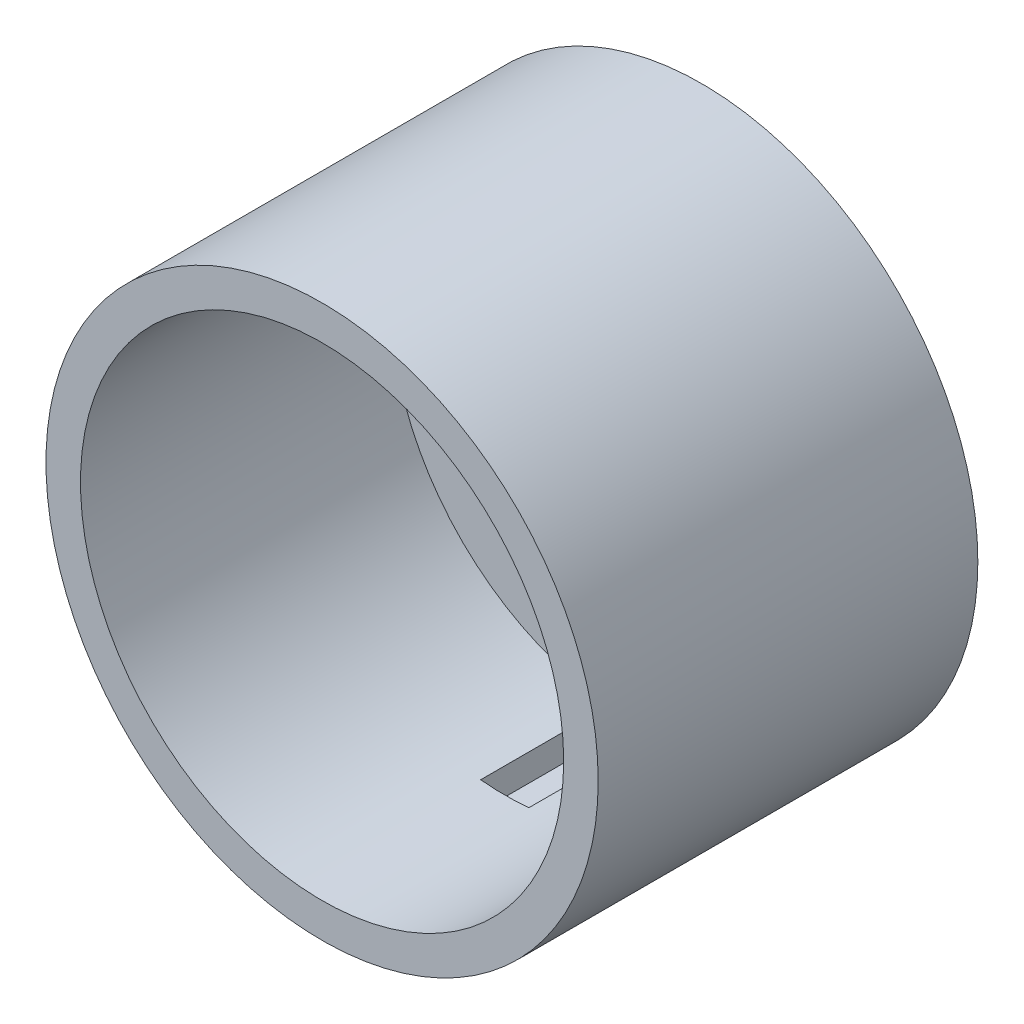
ISO-10303-21;
HEADER;
FILE_DESCRIPTION(('STEP AP214'),'2;1');
FILE_NAME('part.step','',(''),(''),'','','');
FILE_SCHEMA(('AUTOMOTIVE_DESIGN { 1 0 10303 214 1 1 1 1 }'));
ENDSEC;
DATA;
#1=APPLICATION_CONTEXT('core data for automotive mechanical design processes');
#2=APPLICATION_PROTOCOL_DEFINITION('international standard','automotive_design',2000,#1);
#3=PRODUCT_CONTEXT('',#1,'mechanical');
#4=PRODUCT('Part','Part','',(#3));
#5=PRODUCT_RELATED_PRODUCT_CATEGORY('part','',(#4));
#6=PRODUCT_DEFINITION_FORMATION('','',#4);
#7=PRODUCT_DEFINITION_CONTEXT('part definition',#1,'design');
#8=PRODUCT_DEFINITION('design','',#6,#7);
#9=PRODUCT_DEFINITION_SHAPE('','',#8);
#10=(LENGTH_UNIT() NAMED_UNIT(*) SI_UNIT(.MILLI.,.METRE.));
#11=(NAMED_UNIT(*) PLANE_ANGLE_UNIT() SI_UNIT($,.RADIAN.));
#12=(NAMED_UNIT(*) SI_UNIT($,.STERADIAN.) SOLID_ANGLE_UNIT());
#13=UNCERTAINTY_MEASURE_WITH_UNIT(LENGTH_MEASURE(1.E-05),#10,'distance_accuracy_value','');
#14=(GEOMETRIC_REPRESENTATION_CONTEXT(3) GLOBAL_UNCERTAINTY_ASSIGNED_CONTEXT((#13)) GLOBAL_UNIT_ASSIGNED_CONTEXT((#10,
#11,#12)) REPRESENTATION_CONTEXT('',''));
#15=CARTESIAN_POINT('',(0.,0.,0.));
#16=DIRECTION('',(0.,0.,1.));
#17=DIRECTION('',(1.,0.,0.));
#18=AXIS2_PLACEMENT_3D('',#15,#16,#17);
#19=CARTESIAN_POINT('',(-1.4,15.5,11.41));
#20=DIRECTION('',(1.,0.,0.));
#21=DIRECTION('',(0.,1.,0.));
#22=AXIS2_PLACEMENT_3D('',#19,#20,#21);
#23=PLANE('',#22);
#24=DIRECTION('',(0.,0.,-1.));
#25=VECTOR('',#24,1.);
#26=CARTESIAN_POINT('',(-1.4,3.,5.));
#27=LINE('',#26,#25);
#28=CARTESIAN_POINT('',(-1.4,3.,4.));
#29=VERTEX_POINT('',#28);
#30=CARTESIAN_POINT('',(-1.4,3.,0.));
#31=VERTEX_POINT('',#30);
#32=EDGE_CURVE('E202',#29,#31,#27,.T.);
#33=ORIENTED_EDGE('',*,*,#32,.F.);
#34=DIRECTION('',(0.,-1.,0.));
#35=VECTOR('',#34,1.);
#36=CARTESIAN_POINT('',(-1.4,15.5,4.));
#37=LINE('',#36,#35);
#38=CARTESIAN_POINT('',(-1.4,-5.3,4.));
#39=VERTEX_POINT('',#38);
#40=EDGE_CURVE('E175',#29,#39,#37,.T.);
#41=ORIENTED_EDGE('',*,*,#40,.T.);
#42=DIRECTION('',(0.,0.,-1.));
#43=VECTOR('',#42,1.);
#44=CARTESIAN_POINT('',(-1.4,-5.3,5.));
#45=LINE('',#44,#43);
#46=CARTESIAN_POINT('',(-1.4,-5.3,0.));
#47=VERTEX_POINT('',#46);
#48=EDGE_CURVE('E214',#39,#47,#45,.T.);
#49=ORIENTED_EDGE('',*,*,#48,.T.);
#50=DIRECTION('',(0.,-1.,0.));
#51=VECTOR('',#50,1.);
#52=CARTESIAN_POINT('',(-1.4,15.5,0.));
#53=LINE('',#52,#51);
#54=EDGE_CURVE('E236',#31,#47,#53,.T.);
#55=ORIENTED_EDGE('',*,*,#54,.F.);
#56=EDGE_LOOP('',(#33,#41,#49,#55));
#57=FACE_BOUND('',#56,.T.);
#58=ADVANCED_FACE('F33',(#57),#23,.T.);
#59=DIRECTION('',(0.,0.,1.));
#60=VECTOR('',#59,1.);
#61=CARTESIAN_POINT('',(-1.4,13.9298241194927,4.));
#62=LINE('',#61,#60);
#63=CARTESIAN_POINT('',(-1.4,13.9298241194927,4.));
#64=VERTEX_POINT('',#63);
#65=CARTESIAN_POINT('',(-1.4,13.9298241194927,11.41));
#66=VERTEX_POINT('',#65);
#67=EDGE_CURVE('E154',#64,#66,#62,.T.);
#68=ORIENTED_EDGE('',*,*,#67,.F.);
#69=CARTESIAN_POINT('',(-1.4,4.9,4.));
#70=VERTEX_POINT('',#69);
#71=EDGE_CURVE('E168',#64,#70,#37,.T.);
#72=ORIENTED_EDGE('',*,*,#71,.T.);
#73=DIRECTION('',(0.,0.,-1.));
#74=VECTOR('',#73,1.);
#75=CARTESIAN_POINT('',(-1.4,4.9,5.));
#76=LINE('',#75,#74);
#77=CARTESIAN_POINT('',(-1.4,4.9,0.));
#78=VERTEX_POINT('',#77);
#79=EDGE_CURVE('E200',#70,#78,#76,.T.);
#80=ORIENTED_EDGE('',*,*,#79,.T.);
#81=CARTESIAN_POINT('',(-1.4,15.5,0.));
#82=VERTEX_POINT('',#81);
#83=EDGE_CURVE('E232',#82,#78,#53,.T.);
#84=ORIENTED_EDGE('',*,*,#83,.F.);
#85=DIRECTION('',(0.,0.,-1.));
#86=VECTOR('',#85,1.);
#87=CARTESIAN_POINT('',(-1.4,15.5,11.41));
#88=LINE('',#87,#86);
#89=CARTESIAN_POINT('',(-1.4,15.5,11.41));
#90=VERTEX_POINT('',#89);
#91=EDGE_CURVE('E231',#90,#82,#88,.T.);
#92=ORIENTED_EDGE('',*,*,#91,.F.);
#93=DIRECTION('',(0.,-1.,0.));
#94=VECTOR('',#93,1.);
#95=CARTESIAN_POINT('',(-1.4,15.5,11.41));
#96=LINE('',#95,#94);
#97=EDGE_CURVE('E219',#90,#66,#96,.T.);
#98=ORIENTED_EDGE('',*,*,#97,.T.);
#99=EDGE_LOOP('',(#68,#72,#80,#84,#92,#98));
#100=FACE_BOUND('',#99,.T.);
#101=ADVANCED_FACE('F321',(#100),#23,.T.);
#102=CARTESIAN_POINT('',(1.4,15.5,11.41));
#103=DIRECTION('',(-1.,0.,0.));
#104=DIRECTION('',(0.,-1.,0.));
#105=AXIS2_PLACEMENT_3D('',#102,#103,#104);
#106=PLANE('',#105);
#107=DIRECTION('',(0.,0.,-1.));
#108=VECTOR('',#107,1.);
#109=CARTESIAN_POINT('',(1.4,-5.3,5.));
#110=LINE('',#109,#108);
#111=CARTESIAN_POINT('',(1.4,-5.3,4.));
#112=VERTEX_POINT('',#111);
#113=CARTESIAN_POINT('',(1.4,-5.3,0.));
#114=VERTEX_POINT('',#113);
#115=EDGE_CURVE('E211',#112,#114,#110,.T.);
#116=ORIENTED_EDGE('',*,*,#115,.F.);
#117=DIRECTION('',(0.,1.,0.));
#118=VECTOR('',#117,1.);
#119=CARTESIAN_POINT('',(1.4,15.5,4.));
#120=LINE('',#119,#118);
#121=CARTESIAN_POINT('',(1.4,3.,4.));
#122=VERTEX_POINT('',#121);
#123=EDGE_CURVE('E171',#112,#122,#120,.T.);
#124=ORIENTED_EDGE('',*,*,#123,.T.);
#125=DIRECTION('',(0.,0.,-1.));
#126=VECTOR('',#125,1.);
#127=CARTESIAN_POINT('',(1.4,3.,5.));
#128=LINE('',#127,#126);
#129=CARTESIAN_POINT('',(1.4,3.,0.));
#130=VERTEX_POINT('',#129);
#131=EDGE_CURVE('E197',#122,#130,#128,.T.);
#132=ORIENTED_EDGE('',*,*,#131,.T.);
#133=DIRECTION('',(0.,1.,0.));
#134=VECTOR('',#133,1.);
#135=CARTESIAN_POINT('',(1.4,15.5,0.));
#136=LINE('',#135,#134);
#137=EDGE_CURVE('E244',#114,#130,#136,.T.);
#138=ORIENTED_EDGE('',*,*,#137,.F.);
#139=EDGE_LOOP('',(#116,#124,#132,#138));
#140=FACE_BOUND('',#139,.T.);
#141=ADVANCED_FACE('F327',(#140),#106,.T.);
#142=DIRECTION('',(0.,0.,1.));
#143=VECTOR('',#142,1.);
#144=CARTESIAN_POINT('',(1.4,-13.9298241194927,4.));
#145=LINE('',#144,#143);
#146=CARTESIAN_POINT('',(1.4,-13.9298241194927,4.));
#147=VERTEX_POINT('',#146);
#148=CARTESIAN_POINT('',(1.4,-13.9298241194927,11.41));
#149=VERTEX_POINT('',#148);
#150=EDGE_CURVE('E182',#147,#149,#145,.T.);
#151=ORIENTED_EDGE('',*,*,#150,.F.);
#152=CARTESIAN_POINT('',(1.4,-7.2,4.));
#153=VERTEX_POINT('',#152);
#154=EDGE_CURVE('E160',#147,#153,#120,.T.);
#155=ORIENTED_EDGE('',*,*,#154,.T.);
#156=DIRECTION('',(0.,0.,-1.));
#157=VECTOR('',#156,1.);
#158=CARTESIAN_POINT('',(1.4,-7.2,5.));
#159=LINE('',#158,#157);
#160=CARTESIAN_POINT('',(1.4,-7.2,0.));
#161=VERTEX_POINT('',#160);
#162=EDGE_CURVE('E210',#153,#161,#159,.T.);
#163=ORIENTED_EDGE('',*,*,#162,.T.);
#164=CARTESIAN_POINT('',(1.4,-15.5,0.));
#165=VERTEX_POINT('',#164);
#166=EDGE_CURVE('E240',#165,#161,#136,.T.);
#167=ORIENTED_EDGE('',*,*,#166,.F.);
#168=DIRECTION('',(0.,0.,-1.));
#169=VECTOR('',#168,1.);
#170=CARTESIAN_POINT('',(1.4,-15.5,11.41));
#171=LINE('',#170,#169);
#172=CARTESIAN_POINT('',(1.4,-15.5,11.41));
#173=VERTEX_POINT('',#172);
#174=EDGE_CURVE('E252',#173,#165,#171,.T.);
#175=ORIENTED_EDGE('',*,*,#174,.F.);
#176=DIRECTION('',(0.,1.,0.));
#177=VECTOR('',#176,1.);
#178=CARTESIAN_POINT('',(1.4,15.5,11.41));
#179=LINE('',#178,#177);
#180=EDGE_CURVE('E226',#173,#149,#179,.T.);
#181=ORIENTED_EDGE('',*,*,#180,.T.);
#182=EDGE_LOOP('',(#151,#155,#163,#167,#175,#181));
#183=FACE_BOUND('',#182,.T.);
#184=ADVANCED_FACE('F275',(#183),#106,.T.);
#185=CARTESIAN_POINT('',(0.,0.,11.41));
#186=DIRECTION('',(0.,0.,1.));
#187=DIRECTION('',(1.,0.,0.));
#188=AXIS2_PLACEMENT_3D('',#185,#186,#187);
#189=PLANE('',#188);
#190=CARTESIAN_POINT('',(1.4,13.9298241194927,11.41));
#191=VERTEX_POINT('',#190);
#192=CARTESIAN_POINT('',(1.4,15.5,11.41));
#193=VERTEX_POINT('',#192);
#194=EDGE_CURVE('E225',#191,#193,#179,.T.);
#195=ORIENTED_EDGE('',*,*,#194,.F.);
#196=CARTESIAN_POINT('',(0.,0.,11.41));
#197=DIRECTION('',(0.,0.,1.));
#198=DIRECTION('',(1.,0.,0.));
#199=AXIS2_PLACEMENT_3D('',#196,#197,#198);
#200=CIRCLE('',#199,14.);
#201=EDGE_CURVE('E11',#191,#66,#200,.T.);
#202=ORIENTED_EDGE('',*,*,#201,.T.);
#203=ORIENTED_EDGE('',*,*,#97,.F.);
#204=DIRECTION('',(-1.,0.,0.));
#205=VECTOR('',#204,1.);
#206=CARTESIAN_POINT('',(-1.4,15.5,11.41));
#207=LINE('',#206,#205);
#208=EDGE_CURVE('E229',#193,#90,#207,.T.);
#209=ORIENTED_EDGE('',*,*,#208,.F.);
#210=EDGE_LOOP('',(#195,#202,#203,#209));
#211=FACE_BOUND('',#210,.T.);
#212=ADVANCED_FACE('F316',(#211),#189,.F.);
#213=CARTESIAN_POINT('',(1.4,-5.3,5.));
#214=DIRECTION('',(0.,1.,0.));
#215=DIRECTION('',(-1.,0.,0.));
#216=AXIS2_PLACEMENT_3D('',#213,#214,#215);
#217=PLANE('',#216);
#218=ORIENTED_EDGE('',*,*,#48,.F.);
#219=DIRECTION('',(1.,0.,0.));
#220=VECTOR('',#219,1.);
#221=CARTESIAN_POINT('',(1.4,-5.3,4.));
#222=LINE('',#221,#220);
#223=EDGE_CURVE('E176',#39,#112,#222,.T.);
#224=ORIENTED_EDGE('',*,*,#223,.T.);
#225=ORIENTED_EDGE('',*,*,#115,.T.);
#226=DIRECTION('',(1.,0.,0.));
#227=VECTOR('',#226,1.);
#228=CARTESIAN_POINT('',(1.4,-5.3,0.));
#229=LINE('',#228,#227);
#230=EDGE_CURVE('E207',#47,#114,#229,.T.);
#231=ORIENTED_EDGE('',*,*,#230,.F.);
#232=EDGE_LOOP('',(#218,#224,#225,#231));
#233=FACE_BOUND('',#232,.T.);
#234=ADVANCED_FACE('F308',(#233),#217,.T.);
#235=CARTESIAN_POINT('',(1.4,-7.2,5.));
#236=DIRECTION('',(0.,-1.,0.));
#237=DIRECTION('',(1.,0.,0.));
#238=AXIS2_PLACEMENT_3D('',#235,#236,#237);
#239=PLANE('',#238);
#240=ORIENTED_EDGE('',*,*,#162,.F.);
#241=DIRECTION('',(-1.,0.,0.));
#242=VECTOR('',#241,1.);
#243=CARTESIAN_POINT('',(1.4,-7.2,4.));
#244=LINE('',#243,#242);
#245=CARTESIAN_POINT('',(-1.4,-7.2,4.));
#246=VERTEX_POINT('',#245);
#247=EDGE_CURVE('E173',#153,#246,#244,.T.);
#248=ORIENTED_EDGE('',*,*,#247,.T.);
#249=DIRECTION('',(0.,0.,-1.));
#250=VECTOR('',#249,1.);
#251=CARTESIAN_POINT('',(-1.4,-7.2,5.));
#252=LINE('',#251,#250);
#253=CARTESIAN_POINT('',(-1.4,-7.2,0.));
#254=VERTEX_POINT('',#253);
#255=EDGE_CURVE('E216',#246,#254,#252,.T.);
#256=ORIENTED_EDGE('',*,*,#255,.T.);
#257=DIRECTION('',(-1.,0.,0.));
#258=VECTOR('',#257,1.);
#259=CARTESIAN_POINT('',(1.4,-7.2,0.));
#260=LINE('',#259,#258);
#261=EDGE_CURVE('E199',#161,#254,#260,.T.);
#262=ORIENTED_EDGE('',*,*,#261,.F.);
#263=EDGE_LOOP('',(#240,#248,#256,#262));
#264=FACE_BOUND('',#263,.T.);
#265=ADVANCED_FACE('F305',(#264),#239,.T.);
#266=CARTESIAN_POINT('',(1.4,4.9,5.));
#267=DIRECTION('',(0.,1.,0.));
#268=DIRECTION('',(-1.,0.,0.));
#269=AXIS2_PLACEMENT_3D('',#266,#267,#268);
#270=PLANE('',#269);
#271=ORIENTED_EDGE('',*,*,#79,.F.);
#272=DIRECTION('',(1.,0.,0.));
#273=VECTOR('',#272,1.);
#274=CARTESIAN_POINT('',(1.4,4.9,4.));
#275=LINE('',#274,#273);
#276=CARTESIAN_POINT('',(1.4,4.9,4.));
#277=VERTEX_POINT('',#276);
#278=EDGE_CURVE('E169',#70,#277,#275,.T.);
#279=ORIENTED_EDGE('',*,*,#278,.T.);
#280=DIRECTION('',(0.,0.,-1.));
#281=VECTOR('',#280,1.);
#282=CARTESIAN_POINT('',(1.4,4.9,5.));
#283=LINE('',#282,#281);
#284=CARTESIAN_POINT('',(1.4,4.9,0.));
#285=VERTEX_POINT('',#284);
#286=EDGE_CURVE('E167',#277,#285,#283,.T.);
#287=ORIENTED_EDGE('',*,*,#286,.T.);
#288=DIRECTION('',(1.,0.,0.));
#289=VECTOR('',#288,1.);
#290=CARTESIAN_POINT('',(1.4,4.9,0.));
#291=LINE('',#290,#289);
#292=EDGE_CURVE('E194',#78,#285,#291,.T.);
#293=ORIENTED_EDGE('',*,*,#292,.F.);
#294=EDGE_LOOP('',(#271,#279,#287,#293));
#295=FACE_BOUND('',#294,.T.);
#296=ADVANCED_FACE('F307',(#295),#270,.T.);
#297=CARTESIAN_POINT('',(1.4,3.,5.));
#298=DIRECTION('',(0.,-1.,0.));
#299=DIRECTION('',(1.,0.,0.));
#300=AXIS2_PLACEMENT_3D('',#297,#298,#299);
#301=PLANE('',#300);
#302=ORIENTED_EDGE('',*,*,#131,.F.);
#303=DIRECTION('',(-1.,0.,0.));
#304=VECTOR('',#303,1.);
#305=CARTESIAN_POINT('',(1.4,3.,4.));
#306=LINE('',#305,#304);
#307=EDGE_CURVE('E261',#122,#29,#306,.T.);
#308=ORIENTED_EDGE('',*,*,#307,.T.);
#309=ORIENTED_EDGE('',*,*,#32,.T.);
#310=DIRECTION('',(-1.,0.,0.));
#311=VECTOR('',#310,1.);
#312=CARTESIAN_POINT('',(1.4,3.,0.));
#313=LINE('',#312,#311);
#314=EDGE_CURVE('E191',#130,#31,#313,.T.);
#315=ORIENTED_EDGE('',*,*,#314,.F.);
#316=EDGE_LOOP('',(#302,#308,#309,#315));
#317=FACE_BOUND('',#316,.T.);
#318=ADVANCED_FACE('F302',(#317),#301,.T.);
#319=CARTESIAN_POINT('',(0.,0.,0.));
#320=DIRECTION('',(0.,0.,1.));
#321=DIRECTION('',(1.,0.,0.));
#322=AXIS2_PLACEMENT_3D('',#319,#320,#321);
#323=PLANE('',#322);
#324=ORIENTED_EDGE('',*,*,#83,.T.);
#325=ORIENTED_EDGE('',*,*,#292,.T.);
#326=CARTESIAN_POINT('',(1.4,15.5,0.));
#327=VERTEX_POINT('',#326);
#328=EDGE_CURVE('E239',#285,#327,#136,.T.);
#329=ORIENTED_EDGE('',*,*,#328,.T.);
#330=DIRECTION('',(-1.,0.,0.));
#331=VECTOR('',#330,1.);
#332=CARTESIAN_POINT('',(-1.4,15.5,0.));
#333=LINE('',#332,#331);
#334=EDGE_CURVE('E243',#327,#82,#333,.T.);
#335=ORIENTED_EDGE('',*,*,#334,.T.);
#336=EDGE_LOOP('',(#324,#325,#329,#335));
#337=FACE_BOUND('',#336,.T.);
#338=ORIENTED_EDGE('',*,*,#314,.T.);
#339=ORIENTED_EDGE('',*,*,#54,.T.);
#340=ORIENTED_EDGE('',*,*,#230,.T.);
#341=ORIENTED_EDGE('',*,*,#137,.T.);
#342=EDGE_LOOP('',(#338,#339,#340,#341));
#343=FACE_BOUND('',#342,.T.);
#344=CARTESIAN_POINT('',(0.,0.,0.));
#345=DIRECTION('',(0.,0.,1.));
#346=DIRECTION('',(1.,0.,0.));
#347=AXIS2_PLACEMENT_3D('',#344,#345,#346);
#348=CIRCLE('',#347,16.);
#349=CARTESIAN_POINT('',(16.,0.,0.));
#350=VERTEX_POINT('',#349);
#351=EDGE_CURVE('E257',#350,#350,#348,.T.);
#352=ORIENTED_EDGE('',*,*,#351,.F.);
#353=EDGE_LOOP('',(#352));
#354=FACE_BOUND('',#353,.T.);
#355=ORIENTED_EDGE('',*,*,#261,.T.);
#356=CARTESIAN_POINT('',(-1.4,-15.5,0.));
#357=VERTEX_POINT('',#356);
#358=EDGE_CURVE('E213',#254,#357,#53,.T.);
#359=ORIENTED_EDGE('',*,*,#358,.T.);
#360=DIRECTION('',(1.,0.,0.));
#361=VECTOR('',#360,1.);
#362=CARTESIAN_POINT('',(-1.4,-15.5,0.));
#363=LINE('',#362,#361);
#364=EDGE_CURVE('E235',#357,#165,#363,.T.);
#365=ORIENTED_EDGE('',*,*,#364,.T.);
#366=ORIENTED_EDGE('',*,*,#166,.T.);
#367=EDGE_LOOP('',(#355,#359,#365,#366));
#368=FACE_BOUND('',#367,.T.);
#369=ADVANCED_FACE('F297',(#337,#343,#354,#368),#323,.F.);
#370=CARTESIAN_POINT('',(0.,0.,22.));
#371=DIRECTION('',(0.,0.,-1.));
#372=DIRECTION('',(-1.,0.,0.));
#373=AXIS2_PLACEMENT_3D('',#370,#371,#372);
#374=CYLINDRICAL_SURFACE('',#373,16.);
#375=CARTESIAN_POINT('',(0.,0.,22.));
#376=DIRECTION('',(0.,0.,1.));
#377=DIRECTION('',(1.,0.,0.));
#378=AXIS2_PLACEMENT_3D('',#375,#376,#377);
#379=CIRCLE('',#378,16.);
#380=CARTESIAN_POINT('',(16.,0.,22.));
#381=VERTEX_POINT('',#380);
#382=EDGE_CURVE('E258',#381,#381,#379,.T.);
#383=ORIENTED_EDGE('',*,*,#382,.F.);
#384=EDGE_LOOP('',(#383));
#385=FACE_BOUND('',#384,.T.);
#386=ORIENTED_EDGE('',*,*,#351,.T.);
#387=EDGE_LOOP('',(#386));
#388=FACE_BOUND('',#387,.T.);
#389=ADVANCED_FACE('F35',(#385,#388),#374,.T.);
#390=CARTESIAN_POINT('',(0.,0.,22.));
#391=DIRECTION('',(0.,0.,1.));
#392=DIRECTION('',(1.,0.,0.));
#393=AXIS2_PLACEMENT_3D('',#390,#391,#392);
#394=PLANE('',#393);
#395=CARTESIAN_POINT('',(0.,0.,22.));
#396=DIRECTION('',(0.,0.,1.));
#397=DIRECTION('',(1.,0.,0.));
#398=AXIS2_PLACEMENT_3D('',#395,#396,#397);
#399=CIRCLE('',#398,14.);
#400=CARTESIAN_POINT('',(14.,0.,22.));
#401=VERTEX_POINT('',#400);
#402=EDGE_CURVE('E162',#401,#401,#399,.T.);
#403=ORIENTED_EDGE('',*,*,#402,.F.);
#404=EDGE_LOOP('',(#403));
#405=FACE_BOUND('',#404,.T.);
#406=ORIENTED_EDGE('',*,*,#382,.T.);
#407=EDGE_LOOP('',(#406));
#408=FACE_BOUND('',#407,.T.);
#409=ADVANCED_FACE('F289',(#405,#408),#394,.T.);
#410=DIRECTION('',(0.,0.,1.));
#411=VECTOR('',#410,1.);
#412=CARTESIAN_POINT('',(-1.4,-13.9298241194927,4.));
#413=LINE('',#412,#411);
#414=CARTESIAN_POINT('',(-1.4,-13.9298241194927,11.41));
#415=VERTEX_POINT('',#414);
#416=CARTESIAN_POINT('',(-1.4,-13.9298241194927,4.));
#417=VERTEX_POINT('',#416);
#418=EDGE_CURVE('E155',#415,#417,#413,.F.);
#419=ORIENTED_EDGE('',*,*,#418,.F.);
#420=CARTESIAN_POINT('',(-1.4,-15.5,11.41));
#421=VERTEX_POINT('',#420);
#422=EDGE_CURVE('E223',#415,#421,#96,.T.);
#423=ORIENTED_EDGE('',*,*,#422,.T.);
#424=DIRECTION('',(0.,0.,-1.));
#425=VECTOR('',#424,1.);
#426=CARTESIAN_POINT('',(-1.4,-15.5,11.41));
#427=LINE('',#426,#425);
#428=EDGE_CURVE('E254',#421,#357,#427,.T.);
#429=ORIENTED_EDGE('',*,*,#428,.T.);
#430=ORIENTED_EDGE('',*,*,#358,.F.);
#431=ORIENTED_EDGE('',*,*,#255,.F.);
#432=EDGE_CURVE('E48',#246,#417,#37,.T.);
#433=ORIENTED_EDGE('',*,*,#432,.T.);
#434=EDGE_LOOP('',(#419,#423,#429,#430,#431,#433));
#435=FACE_BOUND('',#434,.T.);
#436=ADVANCED_FACE('F283',(#435),#23,.T.);
#437=CARTESIAN_POINT('',(-1.4,-15.5,11.41));
#438=DIRECTION('',(0.,1.,0.));
#439=DIRECTION('',(0.,0.,1.));
#440=AXIS2_PLACEMENT_3D('',#437,#438,#439);
#441=PLANE('',#440);
#442=ORIENTED_EDGE('',*,*,#364,.F.);
#443=ORIENTED_EDGE('',*,*,#428,.F.);
#444=DIRECTION('',(1.,0.,0.));
#445=VECTOR('',#444,1.);
#446=CARTESIAN_POINT('',(-1.4,-15.5,11.41));
#447=LINE('',#446,#445);
#448=EDGE_CURVE('E222',#421,#173,#447,.T.);
#449=ORIENTED_EDGE('',*,*,#448,.T.);
#450=ORIENTED_EDGE('',*,*,#174,.T.);
#451=EDGE_LOOP('',(#442,#443,#449,#450));
#452=FACE_BOUND('',#451,.T.);
#453=ADVANCED_FACE('F279',(#452),#441,.T.);
#454=DIRECTION('',(0.,0.,1.));
#455=VECTOR('',#454,1.);
#456=CARTESIAN_POINT('',(1.4,13.9298241194927,4.));
#457=LINE('',#456,#455);
#458=CARTESIAN_POINT('',(1.4,13.9298241194927,4.));
#459=VERTEX_POINT('',#458);
#460=EDGE_CURVE('E147',#191,#459,#457,.F.);
#461=ORIENTED_EDGE('',*,*,#460,.F.);
#462=ORIENTED_EDGE('',*,*,#194,.T.);
#463=DIRECTION('',(0.,0.,-1.));
#464=VECTOR('',#463,1.);
#465=CARTESIAN_POINT('',(1.4,15.5,11.41));
#466=LINE('',#465,#464);
#467=EDGE_CURVE('E249',#193,#327,#466,.T.);
#468=ORIENTED_EDGE('',*,*,#467,.T.);
#469=ORIENTED_EDGE('',*,*,#328,.F.);
#470=ORIENTED_EDGE('',*,*,#286,.F.);
#471=EDGE_CURVE('E55',#277,#459,#120,.T.);
#472=ORIENTED_EDGE('',*,*,#471,.T.);
#473=EDGE_LOOP('',(#461,#462,#468,#469,#470,#472));
#474=FACE_BOUND('',#473,.T.);
#475=ADVANCED_FACE('F165',(#474),#106,.T.);
#476=CARTESIAN_POINT('',(-1.4,15.5,11.41));
#477=DIRECTION('',(0.,-1.,0.));
#478=DIRECTION('',(0.,0.,-1.));
#479=AXIS2_PLACEMENT_3D('',#476,#477,#478);
#480=PLANE('',#479);
#481=ORIENTED_EDGE('',*,*,#334,.F.);
#482=ORIENTED_EDGE('',*,*,#467,.F.);
#483=ORIENTED_EDGE('',*,*,#208,.T.);
#484=ORIENTED_EDGE('',*,*,#91,.T.);
#485=EDGE_LOOP('',(#481,#482,#483,#484));
#486=FACE_BOUND('',#485,.T.);
#487=ADVANCED_FACE('F337',(#486),#480,.T.);
#488=ORIENTED_EDGE('',*,*,#422,.F.);
#489=EDGE_CURVE('E37',#415,#149,#200,.T.);
#490=ORIENTED_EDGE('',*,*,#489,.T.);
#491=ORIENTED_EDGE('',*,*,#180,.F.);
#492=ORIENTED_EDGE('',*,*,#448,.F.);
#493=EDGE_LOOP('',(#488,#490,#491,#492));
#494=FACE_BOUND('',#493,.T.);
#495=ADVANCED_FACE('F271',(#494),#189,.F.);
#496=CARTESIAN_POINT('',(0.,0.,4.));
#497=DIRECTION('',(0.,0.,1.));
#498=DIRECTION('',(1.,0.,0.));
#499=AXIS2_PLACEMENT_3D('',#496,#497,#498);
#500=CYLINDRICAL_SURFACE('',#499,14.);
#501=ORIENTED_EDGE('',*,*,#67,.T.);
#502=ORIENTED_EDGE('',*,*,#201,.F.);
#503=ORIENTED_EDGE('',*,*,#460,.T.);
#504=CARTESIAN_POINT('',(0.,0.,4.));
#505=DIRECTION('',(0.,0.,1.));
#506=DIRECTION('',(1.,0.,0.));
#507=AXIS2_PLACEMENT_3D('',#504,#505,#506);
#508=CIRCLE('',#507,14.);
#509=EDGE_CURVE('E150',#147,#459,#508,.T.);
#510=ORIENTED_EDGE('',*,*,#509,.F.);
#511=ORIENTED_EDGE('',*,*,#150,.T.);
#512=ORIENTED_EDGE('',*,*,#489,.F.);
#513=ORIENTED_EDGE('',*,*,#418,.T.);
#514=EDGE_CURVE('E161',#64,#417,#508,.T.);
#515=ORIENTED_EDGE('',*,*,#514,.F.);
#516=EDGE_LOOP('',(#501,#502,#503,#510,#511,#512,#513,#515));
#517=FACE_BOUND('',#516,.T.);
#518=ORIENTED_EDGE('',*,*,#402,.T.);
#519=EDGE_LOOP('',(#518));
#520=FACE_BOUND('',#519,.T.);
#521=ADVANCED_FACE('F148',(#517,#520),#500,.F.);
#522=CARTESIAN_POINT('',(0.,0.,4.));
#523=DIRECTION('',(0.,0.,1.));
#524=DIRECTION('',(1.,0.,0.));
#525=AXIS2_PLACEMENT_3D('',#522,#523,#524);
#526=PLANE('',#525);
#527=ORIENTED_EDGE('',*,*,#247,.F.);
#528=ORIENTED_EDGE('',*,*,#154,.F.);
#529=ORIENTED_EDGE('',*,*,#509,.T.);
#530=ORIENTED_EDGE('',*,*,#471,.F.);
#531=ORIENTED_EDGE('',*,*,#278,.F.);
#532=ORIENTED_EDGE('',*,*,#71,.F.);
#533=ORIENTED_EDGE('',*,*,#514,.T.);
#534=ORIENTED_EDGE('',*,*,#432,.F.);
#535=EDGE_LOOP('',(#527,#528,#529,#530,#531,#532,#533,#534));
#536=FACE_BOUND('',#535,.T.);
#537=ORIENTED_EDGE('',*,*,#40,.F.);
#538=ORIENTED_EDGE('',*,*,#307,.F.);
#539=ORIENTED_EDGE('',*,*,#123,.F.);
#540=ORIENTED_EDGE('',*,*,#223,.F.);
#541=EDGE_LOOP('',(#537,#538,#539,#540));
#542=FACE_BOUND('',#541,.T.);
#543=ADVANCED_FACE('F157',(#536,#542),#526,.T.);
#544=CLOSED_SHELL('',(#58,#101,#141,#184,#212,#234,#265,#296,#318,#369,#389,#409,#436,#453,#475,
#487,#495,#521,#543));
#545=MANIFOLD_SOLID_BREP('B2',#544);
#546=ADVANCED_BREP_SHAPE_REPRESENTATION('',(#18,#545),#14);
#547=SHAPE_DEFINITION_REPRESENTATION(#9,#546);
ENDSEC;
END-ISO-10303-21;
